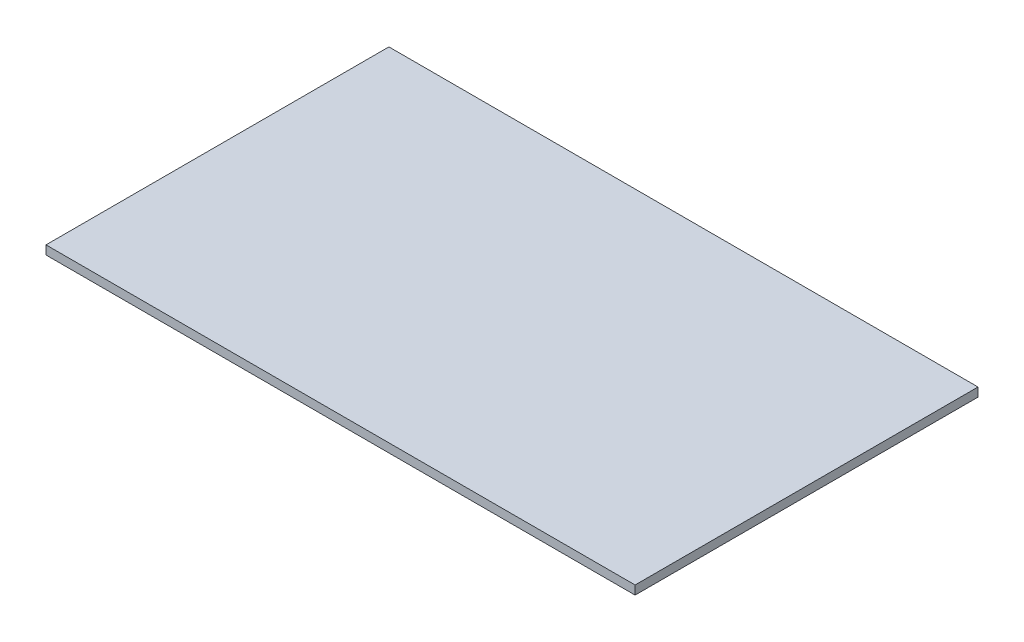
ISO-10303-21;
HEADER;
FILE_DESCRIPTION(('STEP AP214'),'2;1');
FILE_NAME('part.step','',(''),(''),'','','');
FILE_SCHEMA(('AUTOMOTIVE_DESIGN { 1 0 10303 214 1 1 1 1 }'));
ENDSEC;
DATA;
#1=APPLICATION_CONTEXT('core data for automotive mechanical design processes');
#2=APPLICATION_PROTOCOL_DEFINITION('international standard','automotive_design',2000,#1);
#3=PRODUCT_CONTEXT('',#1,'mechanical');
#4=PRODUCT('Part','Part','',(#3));
#5=PRODUCT_RELATED_PRODUCT_CATEGORY('part','',(#4));
#6=PRODUCT_DEFINITION_FORMATION('','',#4);
#7=PRODUCT_DEFINITION_CONTEXT('part definition',#1,'design');
#8=PRODUCT_DEFINITION('design','',#6,#7);
#9=PRODUCT_DEFINITION_SHAPE('','',#8);
#10=(LENGTH_UNIT() NAMED_UNIT(*) SI_UNIT(.MILLI.,.METRE.));
#11=(NAMED_UNIT(*) PLANE_ANGLE_UNIT() SI_UNIT($,.RADIAN.));
#12=(NAMED_UNIT(*) SI_UNIT($,.STERADIAN.) SOLID_ANGLE_UNIT());
#13=UNCERTAINTY_MEASURE_WITH_UNIT(LENGTH_MEASURE(1.E-05),#10,'distance_accuracy_value','');
#14=(GEOMETRIC_REPRESENTATION_CONTEXT(3) GLOBAL_UNCERTAINTY_ASSIGNED_CONTEXT((#13)) GLOBAL_UNIT_ASSIGNED_CONTEXT((#10,
#11,#12)) REPRESENTATION_CONTEXT('',''));
#15=CARTESIAN_POINT('',(0.,0.,0.));
#16=DIRECTION('',(0.,0.,1.));
#17=DIRECTION('',(1.,0.,0.));
#18=AXIS2_PLACEMENT_3D('',#15,#16,#17);
#19=CARTESIAN_POINT('',(33.5,1.,-19.5));
#20=DIRECTION('',(-1.,0.,0.));
#21=DIRECTION('',(0.,0.,1.));
#22=AXIS2_PLACEMENT_3D('',#19,#20,#21);
#23=PLANE('',#22);
#24=DIRECTION('',(0.,0.,-1.));
#25=VECTOR('',#24,1.);
#26=CARTESIAN_POINT('',(33.5,0.,-19.5));
#27=LINE('',#26,#25);
#28=CARTESIAN_POINT('',(33.5,0.,19.5));
#29=VERTEX_POINT('',#28);
#30=CARTESIAN_POINT('',(33.5,0.,-19.5));
#31=VERTEX_POINT('',#30);
#32=EDGE_CURVE('E98',#29,#31,#27,.T.);
#33=ORIENTED_EDGE('',*,*,#32,.T.);
#34=DIRECTION('',(0.,-1.,0.));
#35=VECTOR('',#34,1.);
#36=CARTESIAN_POINT('',(33.5,1.,-19.5));
#37=LINE('',#36,#35);
#38=CARTESIAN_POINT('',(33.5,1.,-19.5));
#39=VERTEX_POINT('',#38);
#40=EDGE_CURVE('E11',#39,#31,#37,.T.);
#41=ORIENTED_EDGE('',*,*,#40,.F.);
#42=DIRECTION('',(0.,0.,-1.));
#43=VECTOR('',#42,1.);
#44=CARTESIAN_POINT('',(33.5,1.,-19.5));
#45=LINE('',#44,#43);
#46=CARTESIAN_POINT('',(33.5,1.,19.5));
#47=VERTEX_POINT('',#46);
#48=EDGE_CURVE('E86',#47,#39,#45,.T.);
#49=ORIENTED_EDGE('',*,*,#48,.F.);
#50=DIRECTION('',(0.,-1.,0.));
#51=VECTOR('',#50,1.);
#52=CARTESIAN_POINT('',(33.5,1.,19.5));
#53=LINE('',#52,#51);
#54=EDGE_CURVE('E94',#47,#29,#53,.T.);
#55=ORIENTED_EDGE('',*,*,#54,.T.);
#56=EDGE_LOOP('',(#33,#41,#49,#55));
#57=FACE_BOUND('',#56,.T.);
#58=ADVANCED_FACE('F35',(#57),#23,.F.);
#59=CARTESIAN_POINT('',(-33.5,1.,-19.5));
#60=DIRECTION('',(0.,0.,1.));
#61=DIRECTION('',(1.,0.,0.));
#62=AXIS2_PLACEMENT_3D('',#59,#60,#61);
#63=PLANE('',#62);
#64=DIRECTION('',(-1.,0.,0.));
#65=VECTOR('',#64,1.);
#66=CARTESIAN_POINT('',(-33.5,0.,-19.5));
#67=LINE('',#66,#65);
#68=CARTESIAN_POINT('',(-33.5,0.,-19.5));
#69=VERTEX_POINT('',#68);
#70=EDGE_CURVE('E90',#31,#69,#67,.T.);
#71=ORIENTED_EDGE('',*,*,#70,.T.);
#72=DIRECTION('',(0.,-1.,0.));
#73=VECTOR('',#72,1.);
#74=CARTESIAN_POINT('',(-33.5,1.,-19.5));
#75=LINE('',#74,#73);
#76=CARTESIAN_POINT('',(-33.5,1.,-19.5));
#77=VERTEX_POINT('',#76);
#78=EDGE_CURVE('E43',#77,#69,#75,.T.);
#79=ORIENTED_EDGE('',*,*,#78,.F.);
#80=DIRECTION('',(-1.,0.,0.));
#81=VECTOR('',#80,1.);
#82=CARTESIAN_POINT('',(-33.5,1.,-19.5));
#83=LINE('',#82,#81);
#84=EDGE_CURVE('E81',#39,#77,#83,.T.);
#85=ORIENTED_EDGE('',*,*,#84,.F.);
#86=ORIENTED_EDGE('',*,*,#40,.T.);
#87=EDGE_LOOP('',(#71,#79,#85,#86));
#88=FACE_BOUND('',#87,.T.);
#89=ADVANCED_FACE('F89',(#88),#63,.F.);
#90=CARTESIAN_POINT('',(-33.5,1.,-19.5));
#91=DIRECTION('',(1.,0.,0.));
#92=DIRECTION('',(0.,0.,-1.));
#93=AXIS2_PLACEMENT_3D('',#90,#91,#92);
#94=PLANE('',#93);
#95=DIRECTION('',(0.,0.,1.));
#96=VECTOR('',#95,1.);
#97=CARTESIAN_POINT('',(-33.5,0.,-19.5));
#98=LINE('',#97,#96);
#99=CARTESIAN_POINT('',(-33.5,0.,19.5));
#100=VERTEX_POINT('',#99);
#101=EDGE_CURVE('E68',#69,#100,#98,.T.);
#102=ORIENTED_EDGE('',*,*,#101,.T.);
#103=DIRECTION('',(0.,-1.,0.));
#104=VECTOR('',#103,1.);
#105=CARTESIAN_POINT('',(-33.5,1.,19.5));
#106=LINE('',#105,#104);
#107=CARTESIAN_POINT('',(-33.5,1.,19.5));
#108=VERTEX_POINT('',#107);
#109=EDGE_CURVE('E91',#108,#100,#106,.T.);
#110=ORIENTED_EDGE('',*,*,#109,.F.);
#111=DIRECTION('',(0.,0.,1.));
#112=VECTOR('',#111,1.);
#113=CARTESIAN_POINT('',(-33.5,1.,-19.5));
#114=LINE('',#113,#112);
#115=EDGE_CURVE('E84',#77,#108,#114,.T.);
#116=ORIENTED_EDGE('',*,*,#115,.F.);
#117=ORIENTED_EDGE('',*,*,#78,.T.);
#118=EDGE_LOOP('',(#102,#110,#116,#117));
#119=FACE_BOUND('',#118,.T.);
#120=ADVANCED_FACE('F92',(#119),#94,.F.);
#121=CARTESIAN_POINT('',(-33.5,1.,19.5));
#122=DIRECTION('',(0.,0.,-1.));
#123=DIRECTION('',(-1.,0.,0.));
#124=AXIS2_PLACEMENT_3D('',#121,#122,#123);
#125=PLANE('',#124);
#126=DIRECTION('',(1.,0.,0.));
#127=VECTOR('',#126,1.);
#128=CARTESIAN_POINT('',(-33.5,0.,19.5));
#129=LINE('',#128,#127);
#130=EDGE_CURVE('E74',#100,#29,#129,.T.);
#131=ORIENTED_EDGE('',*,*,#130,.T.);
#132=ORIENTED_EDGE('',*,*,#54,.F.);
#133=DIRECTION('',(1.,0.,0.));
#134=VECTOR('',#133,1.);
#135=CARTESIAN_POINT('',(-33.5,1.,19.5));
#136=LINE('',#135,#134);
#137=EDGE_CURVE('E51',#108,#47,#136,.T.);
#138=ORIENTED_EDGE('',*,*,#137,.F.);
#139=ORIENTED_EDGE('',*,*,#109,.T.);
#140=EDGE_LOOP('',(#131,#132,#138,#139));
#141=FACE_BOUND('',#140,.T.);
#142=ADVANCED_FACE('F105',(#141),#125,.F.);
#143=CARTESIAN_POINT('',(0.,1.,0.));
#144=DIRECTION('',(0.,1.,0.));
#145=DIRECTION('',(0.,0.,1.));
#146=AXIS2_PLACEMENT_3D('',#143,#144,#145);
#147=PLANE('',#146);
#148=ORIENTED_EDGE('',*,*,#48,.T.);
#149=ORIENTED_EDGE('',*,*,#84,.T.);
#150=ORIENTED_EDGE('',*,*,#115,.T.);
#151=ORIENTED_EDGE('',*,*,#137,.T.);
#152=EDGE_LOOP('',(#148,#149,#150,#151));
#153=FACE_BOUND('',#152,.T.);
#154=ADVANCED_FACE('F82',(#153),#147,.T.);
#155=CARTESIAN_POINT('',(0.,0.,0.));
#156=DIRECTION('',(0.,1.,0.));
#157=DIRECTION('',(0.,0.,1.));
#158=AXIS2_PLACEMENT_3D('',#155,#156,#157);
#159=PLANE('',#158);
#160=ORIENTED_EDGE('',*,*,#32,.F.);
#161=ORIENTED_EDGE('',*,*,#130,.F.);
#162=ORIENTED_EDGE('',*,*,#101,.F.);
#163=ORIENTED_EDGE('',*,*,#70,.F.);
#164=EDGE_LOOP('',(#160,#161,#162,#163));
#165=FACE_BOUND('',#164,.T.);
#166=ADVANCED_FACE('F108',(#165),#159,.F.);
#167=CLOSED_SHELL('',(#58,#89,#120,#142,#154,#166));
#168=MANIFOLD_SOLID_BREP('B2',#167);
#169=ADVANCED_BREP_SHAPE_REPRESENTATION('',(#18,#168),#14);
#170=SHAPE_DEFINITION_REPRESENTATION(#9,#169);
ENDSEC;
END-ISO-10303-21;
